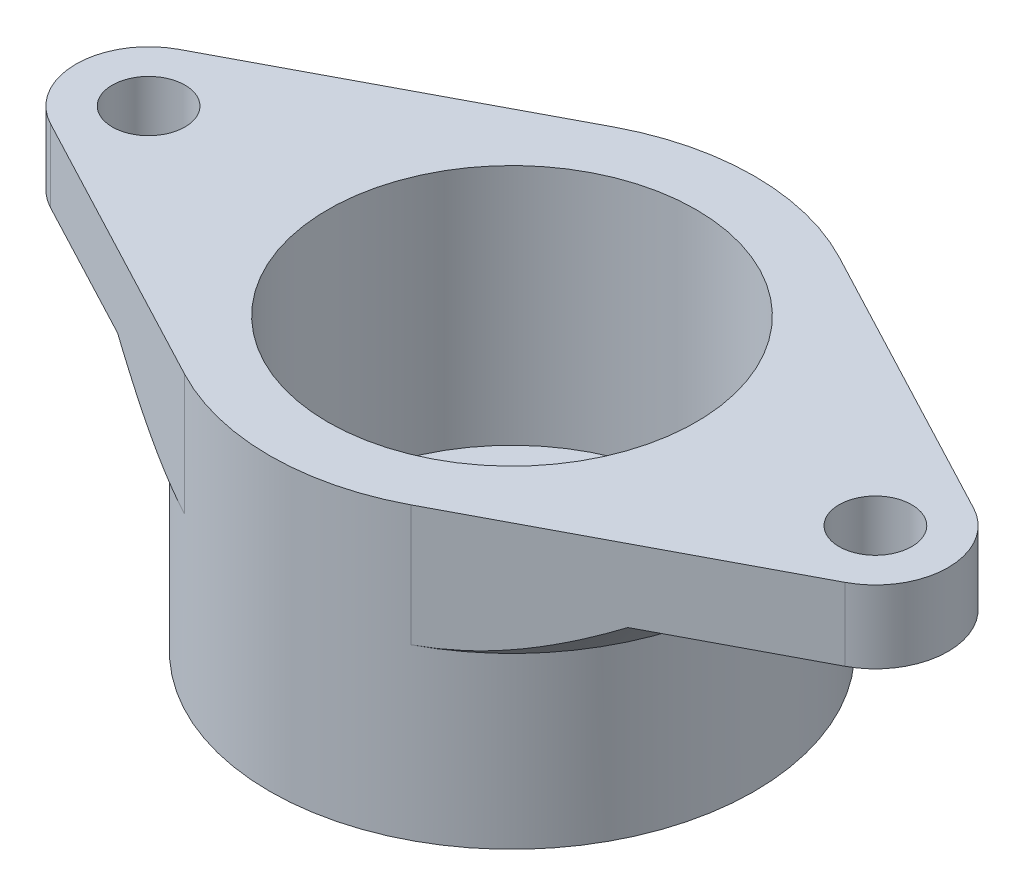
ISO-10303-21;
HEADER;
FILE_DESCRIPTION(('STEP AP214'),'2;1');
FILE_NAME('part.step','',(''),(''),'','','');
FILE_SCHEMA(('AUTOMOTIVE_DESIGN { 1 0 10303 214 1 1 1 1 }'));
ENDSEC;
DATA;
#1=APPLICATION_CONTEXT('core data for automotive mechanical design processes');
#2=APPLICATION_PROTOCOL_DEFINITION('international standard','automotive_design',2000,#1);
#3=PRODUCT_CONTEXT('',#1,'mechanical');
#4=PRODUCT('Part','Part','',(#3));
#5=PRODUCT_RELATED_PRODUCT_CATEGORY('part','',(#4));
#6=PRODUCT_DEFINITION_FORMATION('','',#4);
#7=PRODUCT_DEFINITION_CONTEXT('part definition',#1,'design');
#8=PRODUCT_DEFINITION('design','',#6,#7);
#9=PRODUCT_DEFINITION_SHAPE('','',#8);
#10=(LENGTH_UNIT() NAMED_UNIT(*) SI_UNIT(.MILLI.,.METRE.));
#11=(NAMED_UNIT(*) PLANE_ANGLE_UNIT() SI_UNIT($,.RADIAN.));
#12=(NAMED_UNIT(*) SI_UNIT($,.STERADIAN.) SOLID_ANGLE_UNIT());
#13=UNCERTAINTY_MEASURE_WITH_UNIT(LENGTH_MEASURE(1.E-05),#10,'distance_accuracy_value','');
#14=(GEOMETRIC_REPRESENTATION_CONTEXT(3) GLOBAL_UNCERTAINTY_ASSIGNED_CONTEXT((#13)) GLOBAL_UNIT_ASSIGNED_CONTEXT((#10,
#11,#12)) REPRESENTATION_CONTEXT('',''));
#15=CARTESIAN_POINT('',(0.,0.,0.));
#16=DIRECTION('',(0.,0.,1.));
#17=DIRECTION('',(1.,0.,0.));
#18=AXIS2_PLACEMENT_3D('',#15,#16,#17);
#19=CARTESIAN_POINT('',(0.,2.,0.));
#20=DIRECTION('',(0.,-1.,0.));
#21=DIRECTION('',(0.,0.,-1.));
#22=AXIS2_PLACEMENT_3D('',#19,#20,#21);
#23=CYLINDRICAL_SURFACE('',#22,10.);
#24=CARTESIAN_POINT('',(0.,0.,0.));
#25=DIRECTION('',(0.,1.,0.));
#26=DIRECTION('',(0.,0.,1.));
#27=AXIS2_PLACEMENT_3D('',#24,#25,#26);
#28=CIRCLE('',#27,10.);
#29=CARTESIAN_POINT('',(0.,0.,10.));
#30=VERTEX_POINT('',#29);
#31=EDGE_CURVE('E217',#30,#30,#28,.T.);
#32=ORIENTED_EDGE('',*,*,#31,.T.);
#33=EDGE_LOOP('',(#32));
#34=FACE_BOUND('',#33,.T.);
#35=DIRECTION('',(0.,1.,0.));
#36=VECTOR('',#35,1.);
#37=CARTESIAN_POINT('',(4.66666666666668,9.,-8.84433277428107));
#38=LINE('',#37,#36);
#39=CARTESIAN_POINT('',(4.66666666666667,7.00000000000001,-8.84433277428107));
#40=VERTEX_POINT('',#39);
#41=CARTESIAN_POINT('',(4.66666666666668,12.,-8.84433277428107));
#42=VERTEX_POINT('',#41);
#43=EDGE_CURVE('E168',#40,#42,#38,.T.);
#44=ORIENTED_EDGE('',*,*,#43,.F.);
#45=CARTESIAN_POINT('',(0.,7.00000000000001,0.));
#46=DIRECTION('',(0.,1.,0.));
#47=DIRECTION('',(0.,0.,1.));
#48=AXIS2_PLACEMENT_3D('',#45,#46,#47);
#49=CIRCLE('',#48,10.);
#50=CARTESIAN_POINT('',(4.66666666666667,7.00000000000001,8.84433277428107));
#51=VERTEX_POINT('',#50);
#52=EDGE_CURVE('E228',#40,#51,#49,.F.);
#53=ORIENTED_EDGE('',*,*,#52,.T.);
#54=DIRECTION('',(0.,1.,0.));
#55=VECTOR('',#54,1.);
#56=CARTESIAN_POINT('',(4.66666666666667,9.,8.84433277428107));
#57=LINE('',#56,#55);
#58=CARTESIAN_POINT('',(4.66666666666667,12.,8.84433277428107));
#59=VERTEX_POINT('',#58);
#60=EDGE_CURVE('E148',#51,#59,#57,.T.);
#61=ORIENTED_EDGE('',*,*,#60,.T.);
#62=CARTESIAN_POINT('',(0.,12.,0.));
#63=DIRECTION('',(0.,1.,0.));
#64=DIRECTION('',(0.,0.,1.));
#65=AXIS2_PLACEMENT_3D('',#62,#63,#64);
#66=CIRCLE('',#65,10.);
#67=CARTESIAN_POINT('',(-4.66666666666667,12.,8.84433277428107));
#68=VERTEX_POINT('',#67);
#69=EDGE_CURVE('E208',#68,#59,#66,.T.);
#70=ORIENTED_EDGE('',*,*,#69,.F.);
#71=DIRECTION('',(0.,1.,0.));
#72=VECTOR('',#71,1.);
#73=CARTESIAN_POINT('',(-4.66666666666667,9.,8.84433277428107));
#74=LINE('',#73,#72);
#75=CARTESIAN_POINT('',(-4.66666666666667,7.00000000000001,8.84433277428107));
#76=VERTEX_POINT('',#75);
#77=EDGE_CURVE('E199',#76,#68,#74,.T.);
#78=ORIENTED_EDGE('',*,*,#77,.F.);
#79=CARTESIAN_POINT('',(0.,7.00000000000001,0.));
#80=DIRECTION('',(0.,1.,0.));
#81=DIRECTION('',(0.,0.,1.));
#82=AXIS2_PLACEMENT_3D('',#79,#80,#81);
#83=CIRCLE('',#82,10.);
#84=CARTESIAN_POINT('',(-4.66666666666668,7.00000000000001,-8.84433277428107));
#85=VERTEX_POINT('',#84);
#86=EDGE_CURVE('E225',#76,#85,#83,.F.);
#87=ORIENTED_EDGE('',*,*,#86,.T.);
#88=DIRECTION('',(0.,1.,0.));
#89=VECTOR('',#88,1.);
#90=CARTESIAN_POINT('',(-4.66666666666668,9.,-8.84433277428107));
#91=LINE('',#90,#89);
#92=CARTESIAN_POINT('',(-4.66666666666668,12.,-8.84433277428107));
#93=VERTEX_POINT('',#92);
#94=EDGE_CURVE('E165',#85,#93,#91,.T.);
#95=ORIENTED_EDGE('',*,*,#94,.T.);
#96=EDGE_CURVE('E213',#42,#93,#66,.T.);
#97=ORIENTED_EDGE('',*,*,#96,.F.);
#98=EDGE_LOOP('',(#44,#53,#61,#70,#78,#87,#95,#97));
#99=FACE_BOUND('',#98,.T.);
#100=ADVANCED_FACE('F43',(#34,#99),#23,.T.);
#101=CARTESIAN_POINT('',(0.,2.,0.));
#102=DIRECTION('',(0.,1.,0.));
#103=DIRECTION('',(0.,0.,1.));
#104=AXIS2_PLACEMENT_3D('',#101,#102,#103);
#105=PLANE('',#104);
#106=CARTESIAN_POINT('',(0.,2.,0.));
#107=DIRECTION('',(0.,1.,0.));
#108=DIRECTION('',(0.,0.,1.));
#109=AXIS2_PLACEMENT_3D('',#106,#107,#108);
#110=CIRCLE('',#109,6.);
#111=CARTESIAN_POINT('',(0.,2.,6.));
#112=VERTEX_POINT('',#111);
#113=EDGE_CURVE('E214',#112,#112,#110,.T.);
#114=ORIENTED_EDGE('',*,*,#113,.F.);
#115=EDGE_LOOP('',(#114));
#116=FACE_BOUND('',#115,.T.);
#117=CARTESIAN_POINT('',(0.,2.,0.));
#118=DIRECTION('',(0.,1.,0.));
#119=DIRECTION('',(0.,0.,1.));
#120=AXIS2_PLACEMENT_3D('',#117,#118,#119);
#121=CIRCLE('',#120,7.6);
#122=CARTESIAN_POINT('',(0.,2.,7.6));
#123=VERTEX_POINT('',#122);
#124=EDGE_CURVE('E171',#123,#123,#121,.T.);
#125=ORIENTED_EDGE('',*,*,#124,.T.);
#126=EDGE_LOOP('',(#125));
#127=FACE_BOUND('',#126,.T.);
#128=ADVANCED_FACE('F304',(#116,#127),#105,.T.);
#129=CARTESIAN_POINT('',(0.,0.,0.));
#130=DIRECTION('',(0.,1.,0.));
#131=DIRECTION('',(0.,0.,1.));
#132=AXIS2_PLACEMENT_3D('',#129,#130,#131);
#133=PLANE('',#132);
#134=ORIENTED_EDGE('',*,*,#31,.F.);
#135=EDGE_LOOP('',(#134));
#136=FACE_BOUND('',#135,.T.);
#137=CARTESIAN_POINT('',(0.,0.,0.));
#138=DIRECTION('',(0.,1.,0.));
#139=DIRECTION('',(0.,0.,1.));
#140=AXIS2_PLACEMENT_3D('',#137,#138,#139);
#141=CIRCLE('',#140,6.);
#142=CARTESIAN_POINT('',(0.,0.,6.));
#143=VERTEX_POINT('',#142);
#144=EDGE_CURVE('E218',#143,#143,#141,.T.);
#145=ORIENTED_EDGE('',*,*,#144,.T.);
#146=EDGE_LOOP('',(#145));
#147=FACE_BOUND('',#146,.T.);
#148=ADVANCED_FACE('F310',(#136,#147),#133,.F.);
#149=CARTESIAN_POINT('',(0.,2.,0.));
#150=DIRECTION('',(0.,-1.,0.));
#151=DIRECTION('',(0.,0.,-1.));
#152=AXIS2_PLACEMENT_3D('',#149,#150,#151);
#153=CYLINDRICAL_SURFACE('',#152,6.);
#154=ORIENTED_EDGE('',*,*,#113,.T.);
#155=EDGE_LOOP('',(#154));
#156=FACE_BOUND('',#155,.T.);
#157=ORIENTED_EDGE('',*,*,#144,.F.);
#158=EDGE_LOOP('',(#157));
#159=FACE_BOUND('',#158,.T.);
#160=ADVANCED_FACE('F315',(#156,#159),#153,.F.);
#161=CARTESIAN_POINT('',(0.,12.,0.));
#162=DIRECTION('',(0.,1.,0.));
#163=DIRECTION('',(0.,0.,1.));
#164=AXIS2_PLACEMENT_3D('',#161,#162,#163);
#165=PLANE('',#164);
#166=ORIENTED_EDGE('',*,*,#69,.T.);
#167=DIRECTION('',(-0.884433277428107,0.,0.466666666666667));
#168=VECTOR('',#167,1.);
#169=CARTESIAN_POINT('',(4.66666666666667,12.,8.84433277428107));
#170=LINE('',#169,#168);
#171=CARTESIAN_POINT('',(16.4,12.,2.65329983228432));
#172=VERTEX_POINT('',#171);
#173=EDGE_CURVE('E163',#172,#59,#170,.T.);
#174=ORIENTED_EDGE('',*,*,#173,.F.);
#175=CARTESIAN_POINT('',(15.,12.,0.));
#176=DIRECTION('',(0.,1.,0.));
#177=DIRECTION('',(0.,0.,1.));
#178=AXIS2_PLACEMENT_3D('',#175,#176,#177);
#179=CIRCLE('',#178,3.);
#180=CARTESIAN_POINT('',(16.4,12.,-2.65329983228432));
#181=VERTEX_POINT('',#180);
#182=EDGE_CURVE('E144',#181,#172,#179,.F.);
#183=ORIENTED_EDGE('',*,*,#182,.F.);
#184=DIRECTION('',(-0.884433277428107,0.,-0.466666666666667));
#185=VECTOR('',#184,1.);
#186=CARTESIAN_POINT('',(4.66666666666668,12.,-8.84433277428107));
#187=LINE('',#186,#185);
#188=EDGE_CURVE('E156',#181,#42,#187,.T.);
#189=ORIENTED_EDGE('',*,*,#188,.T.);
#190=ORIENTED_EDGE('',*,*,#96,.T.);
#191=DIRECTION('',(0.884433277428107,0.,-0.466666666666667));
#192=VECTOR('',#191,1.);
#193=CARTESIAN_POINT('',(-4.66666666666668,12.,-8.84433277428107));
#194=LINE('',#193,#192);
#195=CARTESIAN_POINT('',(-16.4,12.,-2.65329983228432));
#196=VERTEX_POINT('',#195);
#197=EDGE_CURVE('E188',#196,#93,#194,.T.);
#198=ORIENTED_EDGE('',*,*,#197,.F.);
#199=CARTESIAN_POINT('',(-15.,12.,0.));
#200=DIRECTION('',(0.,1.,0.));
#201=DIRECTION('',(0.,0.,1.));
#202=AXIS2_PLACEMENT_3D('',#199,#200,#201);
#203=CIRCLE('',#202,3.);
#204=CARTESIAN_POINT('',(-16.4,12.,2.65329983228432));
#205=VERTEX_POINT('',#204);
#206=EDGE_CURVE('E190',#196,#205,#203,.T.);
#207=ORIENTED_EDGE('',*,*,#206,.T.);
#208=DIRECTION('',(0.884433277428107,0.,0.466666666666667));
#209=VECTOR('',#208,1.);
#210=CARTESIAN_POINT('',(-4.66666666666667,12.,8.84433277428107));
#211=LINE('',#210,#209);
#212=EDGE_CURVE('E193',#205,#68,#211,.T.);
#213=ORIENTED_EDGE('',*,*,#212,.T.);
#214=EDGE_LOOP('',(#166,#174,#183,#189,#190,#198,#207,#213));
#215=FACE_BOUND('',#214,.T.);
#216=CARTESIAN_POINT('',(0.,12.,0.));
#217=DIRECTION('',(0.,1.,0.));
#218=DIRECTION('',(0.,0.,1.));
#219=AXIS2_PLACEMENT_3D('',#216,#217,#218);
#220=CIRCLE('',#219,7.6);
#221=CARTESIAN_POINT('',(0.,12.,7.6));
#222=VERTEX_POINT('',#221);
#223=EDGE_CURVE('E205',#222,#222,#220,.T.);
#224=ORIENTED_EDGE('',*,*,#223,.F.);
#225=EDGE_LOOP('',(#224));
#226=FACE_BOUND('',#225,.T.);
#227=CARTESIAN_POINT('',(-15.,12.,0.));
#228=DIRECTION('',(0.,1.,0.));
#229=DIRECTION('',(0.,0.,1.));
#230=AXIS2_PLACEMENT_3D('',#227,#228,#229);
#231=CIRCLE('',#230,1.5);
#232=CARTESIAN_POINT('',(-15.,12.,1.5));
#233=VERTEX_POINT('',#232);
#234=EDGE_CURVE('E178',#233,#233,#231,.T.);
#235=ORIENTED_EDGE('',*,*,#234,.F.);
#236=EDGE_LOOP('',(#235));
#237=FACE_BOUND('',#236,.T.);
#238=CARTESIAN_POINT('',(15.,12.,0.));
#239=DIRECTION('',(0.,1.,0.));
#240=DIRECTION('',(0.,0.,1.));
#241=AXIS2_PLACEMENT_3D('',#238,#239,#240);
#242=CIRCLE('',#241,1.5);
#243=CARTESIAN_POINT('',(15.,12.,1.5));
#244=VERTEX_POINT('',#243);
#245=EDGE_CURVE('E153',#244,#244,#242,.F.);
#246=ORIENTED_EDGE('',*,*,#245,.T.);
#247=EDGE_LOOP('',(#246));
#248=FACE_BOUND('',#247,.T.);
#249=ADVANCED_FACE('F288',(#215,#226,#237,#248),#165,.T.);
#250=CARTESIAN_POINT('',(0.,12.,0.));
#251=DIRECTION('',(0.,-1.,0.));
#252=DIRECTION('',(0.,0.,-1.));
#253=AXIS2_PLACEMENT_3D('',#250,#251,#252);
#254=CYLINDRICAL_SURFACE('',#253,7.6);
#255=ORIENTED_EDGE('',*,*,#223,.T.);
#256=EDGE_LOOP('',(#255));
#257=FACE_BOUND('',#256,.T.);
#258=ORIENTED_EDGE('',*,*,#124,.F.);
#259=EDGE_LOOP('',(#258));
#260=FACE_BOUND('',#259,.T.);
#261=ADVANCED_FACE('F296',(#257,#260),#254,.F.);
#262=CARTESIAN_POINT('',(-4.66666666666668,9.,-8.84433277428107));
#263=DIRECTION('',(0.466666666666667,0.,0.884433277428106));
#264=DIRECTION('',(0.884433277428107,0.,-0.466666666666667));
#265=AXIS2_PLACEMENT_3D('',#262,#263,#264);
#266=PLANE('',#265);
#267=ORIENTED_EDGE('',*,*,#197,.T.);
#268=ORIENTED_EDGE('',*,*,#94,.F.);
#269=CARTESIAN_POINT('',(-4.66666666666667,7.00000000000001,-8.84433277428107));
#270=CARTESIAN_POINT('',(-4.80256638265029,6.9999821341001,-8.77262598861665));
#271=CARTESIAN_POINT('',(-4.93846068037781,7.00354111653174,-8.70092206186717));
#272=CARTESIAN_POINT('',(-5.20994232841902,7.01768003613373,-8.55767616759125));
#273=CARTESIAN_POINT('',(-5.34552972425912,7.02825885269263,-8.48613417604305));
#274=CARTESIAN_POINT('',(-5.61589445066624,7.05627880962663,-8.34347761971858));
#275=CARTESIAN_POINT('',(-5.75067281635561,7.0737072061906,-8.27236250876534));
#276=CARTESIAN_POINT('',(-6.01942591574868,7.11517513626457,-8.13055631913981));
#277=CARTESIAN_POINT('',(-6.15340062541989,7.13921486648233,-8.05986525314814));
#278=CARTESIAN_POINT('',(-6.54951060318434,7.21992548731294,-7.85085986215439));
#279=CARTESIAN_POINT('',(-6.81023192835987,7.28566433558434,-7.7132915968553));
#280=CARTESIAN_POINT('',(-7.32669099041636,7.43868404448317,-7.44078463097025));
#281=CARTESIAN_POINT('',(-7.58242674231267,7.52597330366216,-7.30584697775124));
#282=CARTESIAN_POINT('',(-8.06770299623706,7.71103432665442,-7.04979346007954));
#283=CARTESIAN_POINT('',(-8.2976770443624,7.80736766216171,-6.92844883726008));
#284=CARTESIAN_POINT('',(-8.75294600703984,8.01321089247466,-6.68822851236763));
#285=CARTESIAN_POINT('',(-8.97824072087332,8.12272135114586,-6.56935291620279));
#286=CARTESIAN_POINT('',(-9.42779544182956,8.35461990634579,-6.33214768154339));
#287=CARTESIAN_POINT('',(-9.65198471406808,8.47718196839775,-6.21385536594644));
#288=CARTESIAN_POINT('',(-10.095888299011,8.73185981024529,-5.97963192411813));
#289=CARTESIAN_POINT('',(-10.3156056816543,8.86396873170324,-5.86369917804933));
#290=CARTESIAN_POINT('',(-10.5333333333333,9.,-5.7488163032827));
#291=B_SPLINE_CURVE_WITH_KNOTS('',3,(#269,#270,#271,#272,#273,#274,#275,#276,#277,#278,#279,
#280,#281,#282,#283,#284,#285,#286,#287,#288,#289,#290),.UNSPECIFIED.,.F.,.F.,(4,2,2,2,2,2,2,2,
2,2,4),(0.,0.460920820539447,0.921768079663663,1.38176194961852,1.84176950730396,
2.74683935627807,3.65226248426981,4.48373590804679,5.31524492426985,6.15970130558857,
7.00355695839719),.UNSPECIFIED.);
#292=CARTESIAN_POINT('',(-10.5333333333333,9.,-5.74881630328269));
#293=VERTEX_POINT('',#292);
#294=EDGE_CURVE('E11',#85,#293,#291,.T.);
#295=ORIENTED_EDGE('',*,*,#294,.T.);
#296=DIRECTION('',(0.884433277428107,0.,-0.466666666666667));
#297=VECTOR('',#296,1.);
#298=CARTESIAN_POINT('',(-4.66666666666668,9.,-8.84433277428107));
#299=LINE('',#298,#297);
#300=CARTESIAN_POINT('',(-16.4,9.,-2.65329983228432));
#301=VERTEX_POINT('',#300);
#302=EDGE_CURVE('E175',#301,#293,#299,.T.);
#303=ORIENTED_EDGE('',*,*,#302,.F.);
#304=DIRECTION('',(0.,1.,0.));
#305=VECTOR('',#304,1.);
#306=CARTESIAN_POINT('',(-16.4,9.,-2.65329983228432));
#307=LINE('',#306,#305);
#308=EDGE_CURVE('E187',#301,#196,#307,.T.);
#309=ORIENTED_EDGE('',*,*,#308,.T.);
#310=EDGE_LOOP('',(#267,#268,#295,#303,#309));
#311=FACE_BOUND('',#310,.T.);
#312=ADVANCED_FACE('F275',(#311),#266,.F.);
#313=CARTESIAN_POINT('',(-4.66666666666667,9.,8.84433277428107));
#314=DIRECTION('',(-0.466666666666667,0.,0.884433277428107));
#315=DIRECTION('',(0.884433277428107,0.,0.466666666666667));
#316=AXIS2_PLACEMENT_3D('',#313,#314,#315);
#317=PLANE('',#316);
#318=ORIENTED_EDGE('',*,*,#212,.F.);
#319=DIRECTION('',(0.,1.,0.));
#320=VECTOR('',#319,1.);
#321=CARTESIAN_POINT('',(-16.4,9.,2.65329983228432));
#322=LINE('',#321,#320);
#323=CARTESIAN_POINT('',(-16.4,9.,2.65329983228432));
#324=VERTEX_POINT('',#323);
#325=EDGE_CURVE('E202',#324,#205,#322,.T.);
#326=ORIENTED_EDGE('',*,*,#325,.F.);
#327=DIRECTION('',(0.884433277428107,0.,0.466666666666667));
#328=VECTOR('',#327,1.);
#329=CARTESIAN_POINT('',(-4.66666666666667,9.,8.84433277428107));
#330=LINE('',#329,#328);
#331=CARTESIAN_POINT('',(-10.5333333333333,9.,5.74881630328269));
#332=VERTEX_POINT('',#331);
#333=EDGE_CURVE('E181',#324,#332,#330,.T.);
#334=ORIENTED_EDGE('',*,*,#333,.T.);
#335=CARTESIAN_POINT('',(-10.5333333333333,9.,5.74881630328269));
#336=CARTESIAN_POINT('',(-10.3731911713829,8.89992536601913,5.83331449078592));
#337=CARTESIAN_POINT('',(-10.2119803746976,8.80200093548973,5.91837653790674));
#338=CARTESIAN_POINT('',(-9.88733389514837,8.61115190343218,6.08967458188905));
#339=CARTESIAN_POINT('',(-9.72389900016355,8.51822558628514,6.1759101630302));
#340=CARTESIAN_POINT('',(-9.39389164721545,8.33761102809109,6.35003684426907));
#341=CARTESIAN_POINT('',(-9.22730865016919,8.24994727221375,6.43793350525969));
#342=CARTESIAN_POINT('',(-8.89150039286514,8.08105076076983,6.6151210038248));
#343=CARTESIAN_POINT('',(-8.72227364248088,7.99982180110717,6.70441262765685));
#344=CARTESIAN_POINT('',(-8.21982264364204,7.77133585170855,6.96952831108443));
#345=CARTESIAN_POINT('',(-7.88287766119257,7.63429662882894,7.14731559682181));
#346=CARTESIAN_POINT('',(-7.1994286953238,7.39549896231416,7.50793392595822));
#347=CARTESIAN_POINT('',(-6.85293408717771,7.2937071595098,7.69076002254259));
#348=CARTESIAN_POINT('',(-6.3525477558828,7.17869103489748,7.95478629476745));
#349=CARTESIAN_POINT('',(-6.20170608535682,7.14809046204792,8.03437712584009));
#350=CARTESIAN_POINT('',(-5.89886683591536,7.0951692693373,8.19416869709761));
#351=CARTESIAN_POINT('',(-5.74686919481463,7.0728490981807,8.27436947009423));
#352=CARTESIAN_POINT('',(-5.44040296264724,7.03670095520064,8.43607480011906));
#353=CARTESIAN_POINT('',(-5.28592552577527,7.02296850430836,8.5175840245909));
#354=CARTESIAN_POINT('',(-4.97652428021287,7.00460239384454,8.68083799932712));
#355=CARTESIAN_POINT('',(-4.82160040258839,6.99997022417349,8.7625827859642));
#356=CARTESIAN_POINT('',(-4.66666666666667,7.00000000000002,8.84433277428107));
#357=B_SPLINE_CURVE_WITH_KNOTS('',3,(#335,#336,#337,#338,#339,#340,#341,#342,#343,#344,#345,
#346,#347,#348,#349,#350,#351,#352,#353,#354,#355,#356),.UNSPECIFIED.,.F.,.F.,(4,2,2,2,2,2,2,2,
2,2,4),(0.,0.620657864322217,1.24110130805993,1.86423764020875,2.48773886648281,
3.70098110675873,4.91307194109297,5.43273169939074,5.9524196132802,6.47778972506537,
7.00324584342036),.UNSPECIFIED.);
#358=EDGE_CURVE('E58',#332,#76,#357,.T.);
#359=ORIENTED_EDGE('',*,*,#358,.T.);
#360=ORIENTED_EDGE('',*,*,#77,.T.);
#361=EDGE_LOOP('',(#318,#326,#334,#359,#360));
#362=FACE_BOUND('',#361,.T.);
#363=ADVANCED_FACE('F271',(#362),#317,.T.);
#364=CARTESIAN_POINT('',(-15.,9.,0.));
#365=DIRECTION('',(0.,1.,0.));
#366=DIRECTION('',(0.,0.,1.));
#367=AXIS2_PLACEMENT_3D('',#364,#365,#366);
#368=CYLINDRICAL_SURFACE('',#367,3.);
#369=ORIENTED_EDGE('',*,*,#206,.F.);
#370=ORIENTED_EDGE('',*,*,#308,.F.);
#371=CARTESIAN_POINT('',(-15.,9.,0.));
#372=DIRECTION('',(0.,1.,0.));
#373=DIRECTION('',(0.,0.,1.));
#374=AXIS2_PLACEMENT_3D('',#371,#372,#373);
#375=CIRCLE('',#374,3.);
#376=EDGE_CURVE('E177',#301,#324,#375,.T.);
#377=ORIENTED_EDGE('',*,*,#376,.T.);
#378=ORIENTED_EDGE('',*,*,#325,.T.);
#379=EDGE_LOOP('',(#369,#370,#377,#378));
#380=FACE_BOUND('',#379,.T.);
#381=ADVANCED_FACE('F269',(#380),#368,.T.);
#382=CARTESIAN_POINT('',(-15.,9.,0.));
#383=DIRECTION('',(0.,1.,0.));
#384=DIRECTION('',(0.,0.,1.));
#385=AXIS2_PLACEMENT_3D('',#382,#383,#384);
#386=CYLINDRICAL_SURFACE('',#385,1.5);
#387=CARTESIAN_POINT('',(-15.,9.,0.));
#388=DIRECTION('',(0.,1.,0.));
#389=DIRECTION('',(0.,0.,1.));
#390=AXIS2_PLACEMENT_3D('',#387,#388,#389);
#391=CIRCLE('',#390,1.5);
#392=CARTESIAN_POINT('',(-15.,9.,1.5));
#393=VERTEX_POINT('',#392);
#394=EDGE_CURVE('E184',#393,#393,#391,.T.);
#395=ORIENTED_EDGE('',*,*,#394,.F.);
#396=EDGE_LOOP('',(#395));
#397=FACE_BOUND('',#396,.T.);
#398=ORIENTED_EDGE('',*,*,#234,.T.);
#399=EDGE_LOOP('',(#398));
#400=FACE_BOUND('',#399,.T.);
#401=ADVANCED_FACE('F265',(#397,#400),#386,.F.);
#402=CARTESIAN_POINT('',(0.,9.,0.));
#403=DIRECTION('',(0.,1.,0.));
#404=DIRECTION('',(0.,0.,1.));
#405=AXIS2_PLACEMENT_3D('',#402,#403,#404);
#406=PLANE('',#405);
#407=ORIENTED_EDGE('',*,*,#302,.T.);
#408=CARTESIAN_POINT('',(0.,9.,0.));
#409=DIRECTION('',(0.,1.,0.));
#410=DIRECTION('',(0.,0.,1.));
#411=AXIS2_PLACEMENT_3D('',#408,#409,#410);
#412=CIRCLE('',#411,12.);
#413=EDGE_CURVE('E231',#293,#332,#412,.T.);
#414=ORIENTED_EDGE('',*,*,#413,.T.);
#415=ORIENTED_EDGE('',*,*,#333,.F.);
#416=ORIENTED_EDGE('',*,*,#376,.F.);
#417=EDGE_LOOP('',(#407,#414,#415,#416));
#418=FACE_BOUND('',#417,.T.);
#419=ORIENTED_EDGE('',*,*,#394,.T.);
#420=EDGE_LOOP('',(#419));
#421=FACE_BOUND('',#420,.T.);
#422=ADVANCED_FACE('F255',(#418,#421),#406,.F.);
#423=CARTESIAN_POINT('',(4.66666666666668,9.,-8.84433277428107));
#424=DIRECTION('',(0.466666666666667,0.,-0.884433277428106));
#425=DIRECTION('',(-0.884433277428107,0.,-0.466666666666667));
#426=AXIS2_PLACEMENT_3D('',#423,#424,#425);
#427=PLANE('',#426);
#428=ORIENTED_EDGE('',*,*,#188,.F.);
#429=DIRECTION('',(0.,1.,0.));
#430=VECTOR('',#429,1.);
#431=CARTESIAN_POINT('',(16.4,9.,-2.65329983228432));
#432=LINE('',#431,#430);
#433=CARTESIAN_POINT('',(16.4,9.,-2.65329983228432));
#434=VERTEX_POINT('',#433);
#435=EDGE_CURVE('E147',#434,#181,#432,.T.);
#436=ORIENTED_EDGE('',*,*,#435,.F.);
#437=DIRECTION('',(-0.884433277428107,0.,-0.466666666666667));
#438=VECTOR('',#437,1.);
#439=CARTESIAN_POINT('',(4.66666666666668,9.,-8.84433277428107));
#440=LINE('',#439,#438);
#441=CARTESIAN_POINT('',(10.5333333333333,9.,-5.74881630328269));
#442=VERTEX_POINT('',#441);
#443=EDGE_CURVE('E137',#434,#442,#440,.T.);
#444=ORIENTED_EDGE('',*,*,#443,.T.);
#445=CARTESIAN_POINT('',(10.5333333333333,9.,-5.7488163032827));
#446=CARTESIAN_POINT('',(10.3731911713829,8.89992536601913,-5.83331449078592));
#447=CARTESIAN_POINT('',(10.2119803746976,8.80200093548973,-5.91837653790674));
#448=CARTESIAN_POINT('',(9.88733389514837,8.61115190343218,-6.08967458188905));
#449=CARTESIAN_POINT('',(9.72389900016355,8.51822558628514,-6.1759101630302));
#450=CARTESIAN_POINT('',(9.39389164721545,8.33761102809109,-6.35003684426907));
#451=CARTESIAN_POINT('',(9.22730865016919,8.24994727221376,-6.4379335052597));
#452=CARTESIAN_POINT('',(8.89150039286514,8.08105076076983,-6.6151210038248));
#453=CARTESIAN_POINT('',(8.72227364248088,7.99982180110717,-6.70441262765685));
#454=CARTESIAN_POINT('',(8.21982264364205,7.77133585170855,-6.96952831108444));
#455=CARTESIAN_POINT('',(7.88287766119257,7.63429662882894,-7.14731559682181));
#456=CARTESIAN_POINT('',(7.1994286953238,7.39549896231417,-7.50793392595822));
#457=CARTESIAN_POINT('',(6.85293408717771,7.2937071595098,-7.6907600225426));
#458=CARTESIAN_POINT('',(6.35254775588281,7.17869103489748,-7.95478629476745));
#459=CARTESIAN_POINT('',(6.20170608535682,7.14809046204793,-8.03437712584009));
#460=CARTESIAN_POINT('',(5.89886683591536,7.09516926933731,-8.19416869709761));
#461=CARTESIAN_POINT('',(5.74686919481464,7.07284909818071,-8.27436947009424));
#462=CARTESIAN_POINT('',(5.44040296264724,7.03670095520064,-8.43607480011906));
#463=CARTESIAN_POINT('',(5.28592552577527,7.02296850430836,-8.5175840245909));
#464=CARTESIAN_POINT('',(4.97652428021287,7.00460239384455,-8.68083799932712));
#465=CARTESIAN_POINT('',(4.82160040258839,6.9999702241735,-8.7625827859642));
#466=CARTESIAN_POINT('',(4.66666666666667,7.00000000000002,-8.84433277428107));
#467=B_SPLINE_CURVE_WITH_KNOTS('',3,(#445,#446,#447,#448,#449,#450,#451,#452,#453,#454,#455,
#456,#457,#458,#459,#460,#461,#462,#463,#464,#465,#466),.UNSPECIFIED.,.F.,.F.,(4,2,2,2,2,2,2,2,
2,2,4),(0.,0.620657864322217,1.24110130805993,1.86423764020875,2.48773886648281,
3.70098110675873,4.91307194109297,5.43273169939073,5.9524196132802,6.47778972506536,
7.00324584342035),.UNSPECIFIED.);
#468=EDGE_CURVE('E233',#442,#40,#467,.T.);
#469=ORIENTED_EDGE('',*,*,#468,.T.);
#470=ORIENTED_EDGE('',*,*,#43,.T.);
#471=EDGE_LOOP('',(#428,#436,#444,#469,#470));
#472=FACE_BOUND('',#471,.T.);
#473=ADVANCED_FACE('F250',(#472),#427,.T.);
#474=CARTESIAN_POINT('',(15.,9.,0.));
#475=DIRECTION('',(0.,1.,0.));
#476=DIRECTION('',(0.,0.,1.));
#477=AXIS2_PLACEMENT_3D('',#474,#475,#476);
#478=CYLINDRICAL_SURFACE('',#477,3.);
#479=ORIENTED_EDGE('',*,*,#182,.T.);
#480=DIRECTION('',(0.,1.,0.));
#481=VECTOR('',#480,1.);
#482=CARTESIAN_POINT('',(16.4,9.,2.65329983228432));
#483=LINE('',#482,#481);
#484=CARTESIAN_POINT('',(16.4,9.,2.65329983228432));
#485=VERTEX_POINT('',#484);
#486=EDGE_CURVE('E141',#485,#172,#483,.T.);
#487=ORIENTED_EDGE('',*,*,#486,.F.);
#488=CARTESIAN_POINT('',(15.,9.,0.));
#489=DIRECTION('',(0.,1.,0.));
#490=DIRECTION('',(0.,0.,1.));
#491=AXIS2_PLACEMENT_3D('',#488,#489,#490);
#492=CIRCLE('',#491,3.);
#493=EDGE_CURVE('E128',#434,#485,#492,.F.);
#494=ORIENTED_EDGE('',*,*,#493,.F.);
#495=ORIENTED_EDGE('',*,*,#435,.T.);
#496=EDGE_LOOP('',(#479,#487,#494,#495));
#497=FACE_BOUND('',#496,.T.);
#498=ADVANCED_FACE('F142',(#497),#478,.T.);
#499=CARTESIAN_POINT('',(4.66666666666667,9.,8.84433277428107));
#500=DIRECTION('',(-0.466666666666667,0.,-0.884433277428107));
#501=DIRECTION('',(-0.884433277428107,0.,0.466666666666667));
#502=AXIS2_PLACEMENT_3D('',#499,#500,#501);
#503=PLANE('',#502);
#504=ORIENTED_EDGE('',*,*,#173,.T.);
#505=ORIENTED_EDGE('',*,*,#60,.F.);
#506=CARTESIAN_POINT('',(4.66666666666667,7.00000000000001,8.84433277428107));
#507=CARTESIAN_POINT('',(4.80256638265028,6.9999821341001,8.77262598861664));
#508=CARTESIAN_POINT('',(4.9384606803778,7.00354111653174,8.70092206186716));
#509=CARTESIAN_POINT('',(5.20994232841902,7.01768003613373,8.55767616759125));
#510=CARTESIAN_POINT('',(5.34552972425912,7.02825885269262,8.48613417604305));
#511=CARTESIAN_POINT('',(5.61589445066623,7.05627880962663,8.34347761971858));
#512=CARTESIAN_POINT('',(5.75067281635561,7.07370720619059,8.27236250876533));
#513=CARTESIAN_POINT('',(6.01942591574867,7.11517513626456,8.13055631913981));
#514=CARTESIAN_POINT('',(6.15340062541988,7.13921486648233,8.05986525314814));
#515=CARTESIAN_POINT('',(6.54951060318433,7.21992548731293,7.85085986215439));
#516=CARTESIAN_POINT('',(6.81023192835986,7.28566433558434,7.71329159685529));
#517=CARTESIAN_POINT('',(7.32669099041636,7.43868404448317,7.44078463097025));
#518=CARTESIAN_POINT('',(7.58242674231267,7.52597330366216,7.30584697775124));
#519=CARTESIAN_POINT('',(8.06770299623706,7.71103432665441,7.04979346007954));
#520=CARTESIAN_POINT('',(8.2976770443624,7.8073676621617,6.92844883726008));
#521=CARTESIAN_POINT('',(8.75294600703984,8.01321089247466,6.68822851236763));
#522=CARTESIAN_POINT('',(8.97824072087332,8.12272135114586,6.56935291620279));
#523=CARTESIAN_POINT('',(9.42779544182956,8.35461990634579,6.33214768154339));
#524=CARTESIAN_POINT('',(9.65198471406808,8.47718196839775,6.21385536594643));
#525=CARTESIAN_POINT('',(10.095888299011,8.73185981024529,5.97963192411812));
#526=CARTESIAN_POINT('',(10.3156056816543,8.86396873170324,5.86369917804932));
#527=CARTESIAN_POINT('',(10.5333333333333,9.,5.74881630328269));
#528=B_SPLINE_CURVE_WITH_KNOTS('',3,(#506,#507,#508,#509,#510,#511,#512,#513,#514,#515,#516,
#517,#518,#519,#520,#521,#522,#523,#524,#525,#526,#527),.UNSPECIFIED.,.F.,.F.,(4,2,2,2,2,2,2,2,
2,2,4),(0.,0.460920820539446,0.921768079663662,1.38176194961852,1.84176950730395,
2.74683935627806,3.65226248426981,4.48373590804679,5.31524492426986,6.15970130558858,
7.0035569583972),.UNSPECIFIED.);
#529=CARTESIAN_POINT('',(10.5333333333333,9.,5.74881630328269));
#530=VERTEX_POINT('',#529);
#531=EDGE_CURVE('E152',#51,#530,#528,.T.);
#532=ORIENTED_EDGE('',*,*,#531,.T.);
#533=DIRECTION('',(-0.884433277428107,0.,0.466666666666667));
#534=VECTOR('',#533,1.);
#535=CARTESIAN_POINT('',(4.66666666666667,9.,8.84433277428107));
#536=LINE('',#535,#534);
#537=EDGE_CURVE('E134',#485,#530,#536,.T.);
#538=ORIENTED_EDGE('',*,*,#537,.F.);
#539=ORIENTED_EDGE('',*,*,#486,.T.);
#540=EDGE_LOOP('',(#504,#505,#532,#538,#539));
#541=FACE_BOUND('',#540,.T.);
#542=ADVANCED_FACE('F150',(#541),#503,.F.);
#543=CARTESIAN_POINT('',(15.,9.,0.));
#544=DIRECTION('',(0.,1.,0.));
#545=DIRECTION('',(0.,0.,1.));
#546=AXIS2_PLACEMENT_3D('',#543,#544,#545);
#547=CYLINDRICAL_SURFACE('',#546,1.5);
#548=CARTESIAN_POINT('',(15.,9.,0.));
#549=DIRECTION('',(0.,1.,0.));
#550=DIRECTION('',(0.,0.,1.));
#551=AXIS2_PLACEMENT_3D('',#548,#549,#550);
#552=CIRCLE('',#551,1.5);
#553=CARTESIAN_POINT('',(15.,9.,1.5));
#554=VERTEX_POINT('',#553);
#555=EDGE_CURVE('E160',#554,#554,#552,.F.);
#556=ORIENTED_EDGE('',*,*,#555,.T.);
#557=EDGE_LOOP('',(#556));
#558=FACE_BOUND('',#557,.T.);
#559=ORIENTED_EDGE('',*,*,#245,.F.);
#560=EDGE_LOOP('',(#559));
#561=FACE_BOUND('',#560,.T.);
#562=ADVANCED_FACE('F257',(#558,#561),#547,.F.);
#563=CARTESIAN_POINT('',(0.,9.,0.));
#564=DIRECTION('',(0.,1.,0.));
#565=DIRECTION('',(0.,0.,1.));
#566=AXIS2_PLACEMENT_3D('',#563,#564,#565);
#567=PLANE('',#566);
#568=ORIENTED_EDGE('',*,*,#537,.T.);
#569=CARTESIAN_POINT('',(0.,9.,0.));
#570=DIRECTION('',(0.,1.,0.));
#571=DIRECTION('',(0.,0.,1.));
#572=AXIS2_PLACEMENT_3D('',#569,#570,#571);
#573=CIRCLE('',#572,12.);
#574=EDGE_CURVE('E223',#530,#442,#573,.T.);
#575=ORIENTED_EDGE('',*,*,#574,.T.);
#576=ORIENTED_EDGE('',*,*,#443,.F.);
#577=ORIENTED_EDGE('',*,*,#493,.T.);
#578=EDGE_LOOP('',(#568,#575,#576,#577));
#579=FACE_BOUND('',#578,.T.);
#580=ORIENTED_EDGE('',*,*,#555,.F.);
#581=EDGE_LOOP('',(#580));
#582=FACE_BOUND('',#581,.T.);
#583=ADVANCED_FACE('F130',(#579,#582),#567,.F.);
#584=CARTESIAN_POINT('',(0.,9.,0.));
#585=DIRECTION('',(0.,1.,0.));
#586=DIRECTION('',(0.,0.,1.));
#587=AXIS2_PLACEMENT_3D('',#584,#585,#586);
#588=CONICAL_SURFACE('',#587,12.,0.785398163397453);
#589=ORIENTED_EDGE('',*,*,#531,.F.);
#590=ORIENTED_EDGE('',*,*,#52,.F.);
#591=ORIENTED_EDGE('',*,*,#468,.F.);
#592=ORIENTED_EDGE('',*,*,#574,.F.);
#593=EDGE_LOOP('',(#589,#590,#591,#592));
#594=FACE_BOUND('',#593,.T.);
#595=ADVANCED_FACE('F247',(#594),#588,.T.);
#596=CARTESIAN_POINT('',(0.,9.,0.));
#597=DIRECTION('',(0.,1.,0.));
#598=DIRECTION('',(0.,0.,1.));
#599=AXIS2_PLACEMENT_3D('',#596,#597,#598);
#600=CONICAL_SURFACE('',#599,12.,0.785398163397453);
#601=ORIENTED_EDGE('',*,*,#294,.F.);
#602=ORIENTED_EDGE('',*,*,#86,.F.);
#603=ORIENTED_EDGE('',*,*,#358,.F.);
#604=ORIENTED_EDGE('',*,*,#413,.F.);
#605=EDGE_LOOP('',(#601,#602,#603,#604));
#606=FACE_BOUND('',#605,.T.);
#607=ADVANCED_FACE('F46',(#606),#600,.T.);
#608=CLOSED_SHELL('',(#100,#128,#148,#160,#249,#261,#312,#363,#381,#401,#422,#473,#498,#542,
#562,#583,#595,#607));
#609=MANIFOLD_SOLID_BREP('B2',#608);
#610=ADVANCED_BREP_SHAPE_REPRESENTATION('',(#18,#609),#14);
#611=SHAPE_DEFINITION_REPRESENTATION(#9,#610);
ENDSEC;
END-ISO-10303-21;
